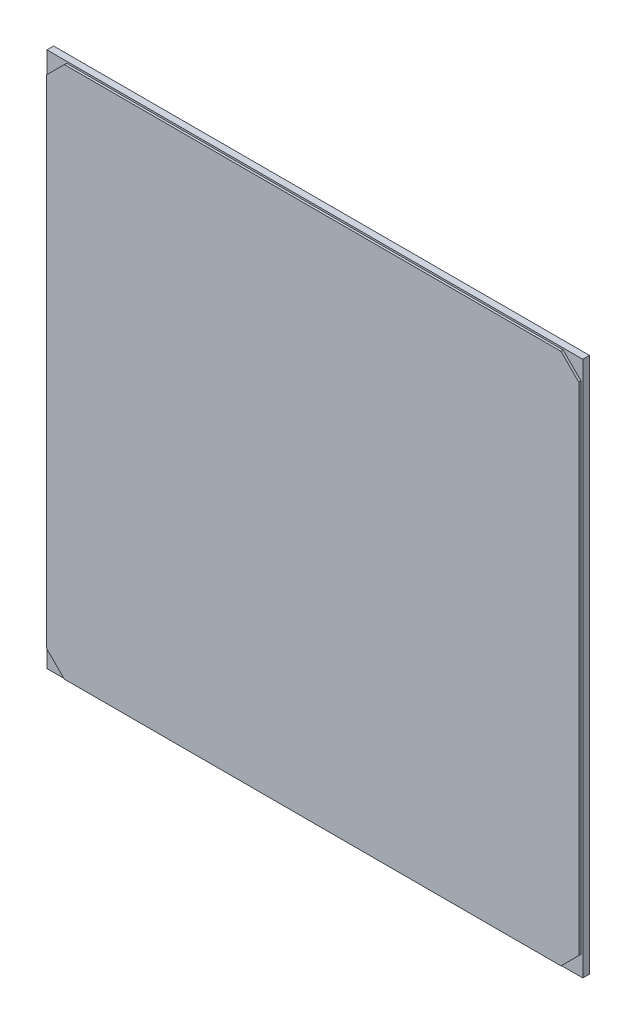
ISO-10303-21;
HEADER;
FILE_DESCRIPTION(('STEP AP214'),'2;1');
FILE_NAME('part.step','',(''),(''),'','','');
FILE_SCHEMA(('AUTOMOTIVE_DESIGN { 1 0 10303 214 1 1 1 1 }'));
ENDSEC;
DATA;
#1=APPLICATION_CONTEXT('core data for automotive mechanical design processes');
#2=APPLICATION_PROTOCOL_DEFINITION('international standard','automotive_design',2000,#1);
#3=PRODUCT_CONTEXT('',#1,'mechanical');
#4=PRODUCT('Part','Part','',(#3));
#5=PRODUCT_RELATED_PRODUCT_CATEGORY('part','',(#4));
#6=PRODUCT_DEFINITION_FORMATION('','',#4);
#7=PRODUCT_DEFINITION_CONTEXT('part definition',#1,'design');
#8=PRODUCT_DEFINITION('design','',#6,#7);
#9=PRODUCT_DEFINITION_SHAPE('','',#8);
#10=(LENGTH_UNIT() NAMED_UNIT(*) SI_UNIT(.MILLI.,.METRE.));
#11=(NAMED_UNIT(*) PLANE_ANGLE_UNIT() SI_UNIT($,.RADIAN.));
#12=(NAMED_UNIT(*) SI_UNIT($,.STERADIAN.) SOLID_ANGLE_UNIT());
#13=UNCERTAINTY_MEASURE_WITH_UNIT(LENGTH_MEASURE(1.E-05),#10,'distance_accuracy_value','');
#14=(GEOMETRIC_REPRESENTATION_CONTEXT(3) GLOBAL_UNCERTAINTY_ASSIGNED_CONTEXT((#13)) GLOBAL_UNIT_ASSIGNED_CONTEXT((#10,
#11,#12)) REPRESENTATION_CONTEXT('',''));
#15=CARTESIAN_POINT('',(0.,0.,0.));
#16=DIRECTION('',(0.,0.,1.));
#17=DIRECTION('',(1.,0.,0.));
#18=AXIS2_PLACEMENT_3D('',#15,#16,#17);
#19=CARTESIAN_POINT('',(0.,0.,3.75));
#20=DIRECTION('',(0.,0.,1.));
#21=DIRECTION('',(1.,0.,0.));
#22=AXIS2_PLACEMENT_3D('',#19,#20,#21);
#23=PLANE('',#22);
#24=DIRECTION('',(0.,-1.,0.));
#25=VECTOR('',#24,1.);
#26=CARTESIAN_POINT('',(-150.00000000001,150.00000000001,3.75000000001));
#27=LINE('',#26,#25);
#28=CARTESIAN_POINT('',(-150.,150.,3.75));
#29=VERTEX_POINT('',#28);
#30=CARTESIAN_POINT('',(-150.,-150.,3.75));
#31=VERTEX_POINT('',#30);
#32=EDGE_CURVE('E11',#29,#31,#27,.T.);
#33=ORIENTED_EDGE('',*,*,#32,.T.);
#34=DIRECTION('',(1.,0.,0.));
#35=VECTOR('',#34,1.);
#36=CARTESIAN_POINT('',(-150.00000000001,-150.00000000001,3.75000000001));
#37=LINE('',#36,#35);
#38=CARTESIAN_POINT('',(150.,-150.,3.75));
#39=VERTEX_POINT('',#38);
#40=EDGE_CURVE('E28',#31,#39,#37,.T.);
#41=ORIENTED_EDGE('',*,*,#40,.T.);
#42=DIRECTION('',(0.,1.,0.));
#43=VECTOR('',#42,1.);
#44=CARTESIAN_POINT('',(150.00000000001,150.00000000001,3.75000000001));
#45=LINE('',#44,#43);
#46=CARTESIAN_POINT('',(150.,150.,3.75));
#47=VERTEX_POINT('',#46);
#48=EDGE_CURVE('E21',#39,#47,#45,.T.);
#49=ORIENTED_EDGE('',*,*,#48,.T.);
#50=DIRECTION('',(-1.,0.,0.));
#51=VECTOR('',#50,1.);
#52=CARTESIAN_POINT('',(-150.00000000001,150.00000000001,3.75000000001));
#53=LINE('',#52,#51);
#54=EDGE_CURVE('E156',#47,#29,#53,.T.);
#55=ORIENTED_EDGE('',*,*,#54,.T.);
#56=EDGE_LOOP('',(#33,#41,#49,#55));
#57=FACE_BOUND('',#56,.T.);
#58=DIRECTION('',(0.707106781186548,-0.707106781186548,0.));
#59=VECTOR('',#58,1.);
#60=CARTESIAN_POINT('',(-149.00000000001,-139.00000000001,3.75000000001));
#61=LINE('',#60,#59);
#62=CARTESIAN_POINT('',(-149.,-139.,3.75));
#63=VERTEX_POINT('',#62);
#64=CARTESIAN_POINT('',(-139.,-149.,3.75));
#65=VERTEX_POINT('',#64);
#66=EDGE_CURVE('E695',#63,#65,#61,.T.);
#67=ORIENTED_EDGE('',*,*,#66,.F.);
#68=DIRECTION('',(0.,-1.,0.));
#69=VECTOR('',#68,1.);
#70=CARTESIAN_POINT('',(-149.00000000001,139.00000000001,3.75000000001));
#71=LINE('',#70,#69);
#72=CARTESIAN_POINT('',(-149.,139.,3.75));
#73=VERTEX_POINT('',#72);
#74=EDGE_CURVE('E694',#73,#63,#71,.T.);
#75=ORIENTED_EDGE('',*,*,#74,.F.);
#76=DIRECTION('',(-0.707106781186548,-0.707106781186548,0.));
#77=VECTOR('',#76,1.);
#78=CARTESIAN_POINT('',(-139.00000000001,149.00000000001,3.75000000001));
#79=LINE('',#78,#77);
#80=CARTESIAN_POINT('',(-139.,149.,3.75));
#81=VERTEX_POINT('',#80);
#82=EDGE_CURVE('E195',#81,#73,#79,.T.);
#83=ORIENTED_EDGE('',*,*,#82,.F.);
#84=DIRECTION('',(-1.,0.,0.));
#85=VECTOR('',#84,1.);
#86=CARTESIAN_POINT('',(139.00000000001,149.00000000001,3.75000000001));
#87=LINE('',#86,#85);
#88=CARTESIAN_POINT('',(139.,149.,3.75));
#89=VERTEX_POINT('',#88);
#90=EDGE_CURVE('E194',#89,#81,#87,.T.);
#91=ORIENTED_EDGE('',*,*,#90,.F.);
#92=DIRECTION('',(-0.707106781186548,0.707106781186548,0.));
#93=VECTOR('',#92,1.);
#94=CARTESIAN_POINT('',(149.00000000001,139.00000000001,3.75000000001));
#95=LINE('',#94,#93);
#96=CARTESIAN_POINT('',(149.,139.,3.75));
#97=VERTEX_POINT('',#96);
#98=EDGE_CURVE('E208',#97,#89,#95,.T.);
#99=ORIENTED_EDGE('',*,*,#98,.F.);
#100=DIRECTION('',(0.,1.,0.));
#101=VECTOR('',#100,1.);
#102=CARTESIAN_POINT('',(149.00000000001,-139.00000000001,3.75000000001));
#103=LINE('',#102,#101);
#104=CARTESIAN_POINT('',(149.,-139.,3.75));
#105=VERTEX_POINT('',#104);
#106=EDGE_CURVE('E759',#105,#97,#103,.T.);
#107=ORIENTED_EDGE('',*,*,#106,.F.);
#108=DIRECTION('',(0.707106781186548,0.707106781186548,0.));
#109=VECTOR('',#108,1.);
#110=CARTESIAN_POINT('',(139.00000000001,-149.00000000001,3.75000000001));
#111=LINE('',#110,#109);
#112=CARTESIAN_POINT('',(139.,-149.,3.75));
#113=VERTEX_POINT('',#112);
#114=EDGE_CURVE('E69',#113,#105,#111,.T.);
#115=ORIENTED_EDGE('',*,*,#114,.F.);
#116=DIRECTION('',(1.,0.,0.));
#117=VECTOR('',#116,1.);
#118=CARTESIAN_POINT('',(-139.00000000001,-149.00000000001,3.75000000001));
#119=LINE('',#118,#117);
#120=EDGE_CURVE('E79',#65,#113,#119,.T.);
#121=ORIENTED_EDGE('',*,*,#120,.F.);
#122=EDGE_LOOP('',(#67,#75,#83,#91,#99,#107,#115,#121));
#123=FACE_BOUND('',#122,.T.);
#124=ADVANCED_FACE('F17',(#57,#123),#23,.T.);
#125=CARTESIAN_POINT('',(-150.,150.,3.75));
#126=DIRECTION('',(1.,0.,0.));
#127=DIRECTION('',(0.,1.,0.));
#128=AXIS2_PLACEMENT_3D('',#125,#126,#127);
#129=PLANE('',#128);
#130=DIRECTION('',(0.,-1.,0.));
#131=VECTOR('',#130,1.);
#132=CARTESIAN_POINT('',(-150.00000000001,150.00000000001,0.));
#133=LINE('',#132,#131);
#134=CARTESIAN_POINT('',(-150.,150.,0.));
#135=VERTEX_POINT('',#134);
#136=CARTESIAN_POINT('',(-150.,-150.,0.));
#137=VERTEX_POINT('',#136);
#138=EDGE_CURVE('E163',#135,#137,#133,.T.);
#139=ORIENTED_EDGE('',*,*,#138,.T.);
#140=DIRECTION('',(0.,0.,-1.));
#141=VECTOR('',#140,1.);
#142=CARTESIAN_POINT('',(-150.00000000001,-150.00000000001,3.75000000001));
#143=LINE('',#142,#141);
#144=EDGE_CURVE('E169',#31,#137,#143,.T.);
#145=ORIENTED_EDGE('',*,*,#144,.F.);
#146=ORIENTED_EDGE('',*,*,#32,.F.);
#147=DIRECTION('',(0.,0.,-1.));
#148=VECTOR('',#147,1.);
#149=CARTESIAN_POINT('',(-150.00000000001,150.00000000001,3.75000000001));
#150=LINE('',#149,#148);
#151=EDGE_CURVE('E167',#29,#135,#150,.T.);
#152=ORIENTED_EDGE('',*,*,#151,.T.);
#153=EDGE_LOOP('',(#139,#145,#146,#152));
#154=FACE_BOUND('',#153,.T.);
#155=ADVANCED_FACE('F19',(#154),#129,.F.);
#156=CARTESIAN_POINT('',(-150.,-150.,3.75));
#157=DIRECTION('',(0.,1.,0.));
#158=DIRECTION('',(1.,0.,0.));
#159=AXIS2_PLACEMENT_3D('',#156,#157,#158);
#160=PLANE('',#159);
#161=DIRECTION('',(1.,0.,0.));
#162=VECTOR('',#161,1.);
#163=CARTESIAN_POINT('',(-150.00000000001,-150.00000000001,0.));
#164=LINE('',#163,#162);
#165=CARTESIAN_POINT('',(150.,-150.,0.));
#166=VERTEX_POINT('',#165);
#167=EDGE_CURVE('E175',#137,#166,#164,.T.);
#168=ORIENTED_EDGE('',*,*,#167,.T.);
#169=DIRECTION('',(0.,0.,-1.));
#170=VECTOR('',#169,1.);
#171=CARTESIAN_POINT('',(150.00000000001,-150.00000000001,3.75000000001));
#172=LINE('',#171,#170);
#173=EDGE_CURVE('E817',#39,#166,#172,.T.);
#174=ORIENTED_EDGE('',*,*,#173,.F.);
#175=ORIENTED_EDGE('',*,*,#40,.F.);
#176=ORIENTED_EDGE('',*,*,#144,.T.);
#177=EDGE_LOOP('',(#168,#174,#175,#176));
#178=FACE_BOUND('',#177,.T.);
#179=ADVANCED_FACE('F360',(#178),#160,.F.);
#180=CARTESIAN_POINT('',(150.,150.,3.75));
#181=DIRECTION('',(-1.,0.,0.));
#182=DIRECTION('',(0.,1.,0.));
#183=AXIS2_PLACEMENT_3D('',#180,#181,#182);
#184=PLANE('',#183);
#185=DIRECTION('',(0.,1.,0.));
#186=VECTOR('',#185,1.);
#187=CARTESIAN_POINT('',(150.00000000001,150.00000000001,0.));
#188=LINE('',#187,#186);
#189=CARTESIAN_POINT('',(150.,150.,0.));
#190=VERTEX_POINT('',#189);
#191=EDGE_CURVE('E818',#166,#190,#188,.T.);
#192=ORIENTED_EDGE('',*,*,#191,.T.);
#193=DIRECTION('',(0.,0.,-1.));
#194=VECTOR('',#193,1.);
#195=CARTESIAN_POINT('',(150.00000000001,150.00000000001,3.75000000001));
#196=LINE('',#195,#194);
#197=EDGE_CURVE('E811',#47,#190,#196,.T.);
#198=ORIENTED_EDGE('',*,*,#197,.F.);
#199=ORIENTED_EDGE('',*,*,#48,.F.);
#200=ORIENTED_EDGE('',*,*,#173,.T.);
#201=EDGE_LOOP('',(#192,#198,#199,#200));
#202=FACE_BOUND('',#201,.T.);
#203=ADVANCED_FACE('F353',(#202),#184,.F.);
#204=CARTESIAN_POINT('',(-150.,150.,3.75));
#205=DIRECTION('',(0.,-1.,0.));
#206=DIRECTION('',(0.,0.,-1.));
#207=AXIS2_PLACEMENT_3D('',#204,#205,#206);
#208=PLANE('',#207);
#209=DIRECTION('',(-1.,0.,0.));
#210=VECTOR('',#209,1.);
#211=CARTESIAN_POINT('',(-150.00000000001,150.00000000001,0.));
#212=LINE('',#211,#210);
#213=EDGE_CURVE('E173',#190,#135,#212,.T.);
#214=ORIENTED_EDGE('',*,*,#213,.T.);
#215=ORIENTED_EDGE('',*,*,#151,.F.);
#216=ORIENTED_EDGE('',*,*,#54,.F.);
#217=ORIENTED_EDGE('',*,*,#197,.T.);
#218=EDGE_LOOP('',(#214,#215,#216,#217));
#219=FACE_BOUND('',#218,.T.);
#220=ADVANCED_FACE('F171',(#219),#208,.F.);
#221=CARTESIAN_POINT('',(0.,0.,0.));
#222=DIRECTION('',(0.,0.,1.));
#223=DIRECTION('',(1.,0.,0.));
#224=AXIS2_PLACEMENT_3D('',#221,#222,#223);
#225=PLANE('',#224);
#226=ORIENTED_EDGE('',*,*,#138,.F.);
#227=ORIENTED_EDGE('',*,*,#213,.F.);
#228=ORIENTED_EDGE('',*,*,#191,.F.);
#229=ORIENTED_EDGE('',*,*,#167,.F.);
#230=EDGE_LOOP('',(#226,#227,#228,#229));
#231=FACE_BOUND('',#230,.T.);
#232=ADVANCED_FACE('F339',(#231),#225,.F.);
#233=CARTESIAN_POINT('',(-149.,139.,5.));
#234=DIRECTION('',(1.,0.,0.));
#235=DIRECTION('',(0.,1.,0.));
#236=AXIS2_PLACEMENT_3D('',#233,#234,#235);
#237=PLANE('',#236);
#238=ORIENTED_EDGE('',*,*,#74,.T.);
#239=DIRECTION('',(0.,0.,-1.));
#240=VECTOR('',#239,1.);
#241=CARTESIAN_POINT('',(-149.00000000001,-139.00000000001,5.00000000001));
#242=LINE('',#241,#240);
#243=CARTESIAN_POINT('',(-149.,-139.,5.));
#244=VERTEX_POINT('',#243);
#245=EDGE_CURVE('E711',#244,#63,#242,.T.);
#246=ORIENTED_EDGE('',*,*,#245,.F.);
#247=DIRECTION('',(0.,-1.,0.));
#248=VECTOR('',#247,1.);
#249=CARTESIAN_POINT('',(-149.00000000001,139.00000000001,5.00000000001));
#250=LINE('',#249,#248);
#251=CARTESIAN_POINT('',(-149.,139.,5.));
#252=VERTEX_POINT('',#251);
#253=EDGE_CURVE('E224',#252,#244,#250,.T.);
#254=ORIENTED_EDGE('',*,*,#253,.F.);
#255=DIRECTION('',(0.,0.,-1.));
#256=VECTOR('',#255,1.);
#257=CARTESIAN_POINT('',(-149.00000000001,139.00000000001,5.00000000001));
#258=LINE('',#257,#256);
#259=EDGE_CURVE('E233',#252,#73,#258,.T.);
#260=ORIENTED_EDGE('',*,*,#259,.T.);
#261=EDGE_LOOP('',(#238,#246,#254,#260));
#262=FACE_BOUND('',#261,.T.);
#263=ADVANCED_FACE('F331',(#262),#237,.F.);
#264=CARTESIAN_POINT('',(-149.,-139.,5.));
#265=DIRECTION('',(0.707106781186548,0.707106781186548,0.));
#266=DIRECTION('',(0.,0.,-1.));
#267=AXIS2_PLACEMENT_3D('',#264,#265,#266);
#268=PLANE('',#267);
#269=ORIENTED_EDGE('',*,*,#66,.T.);
#270=DIRECTION('',(0.,0.,-1.));
#271=VECTOR('',#270,1.);
#272=CARTESIAN_POINT('',(-139.00000000001,-149.00000000001,5.00000000001));
#273=LINE('',#272,#271);
#274=CARTESIAN_POINT('',(-139.,-149.,5.));
#275=VERTEX_POINT('',#274);
#276=EDGE_CURVE('E731',#275,#65,#273,.T.);
#277=ORIENTED_EDGE('',*,*,#276,.F.);
#278=DIRECTION('',(0.707106781186548,-0.707106781186548,0.));
#279=VECTOR('',#278,1.);
#280=CARTESIAN_POINT('',(-149.00000000001,-139.00000000001,5.00000000001));
#281=LINE('',#280,#279);
#282=EDGE_CURVE('E132',#244,#275,#281,.T.);
#283=ORIENTED_EDGE('',*,*,#282,.F.);
#284=ORIENTED_EDGE('',*,*,#245,.T.);
#285=EDGE_LOOP('',(#269,#277,#283,#284));
#286=FACE_BOUND('',#285,.T.);
#287=ADVANCED_FACE('F323',(#286),#268,.F.);
#288=CARTESIAN_POINT('',(-139.,-149.,5.));
#289=DIRECTION('',(0.,1.,0.));
#290=DIRECTION('',(1.,0.,0.));
#291=AXIS2_PLACEMENT_3D('',#288,#289,#290);
#292=PLANE('',#291);
#293=ORIENTED_EDGE('',*,*,#120,.T.);
#294=DIRECTION('',(0.,0.,-1.));
#295=VECTOR('',#294,1.);
#296=CARTESIAN_POINT('',(139.00000000001,-149.00000000001,5.00000000001));
#297=LINE('',#296,#295);
#298=CARTESIAN_POINT('',(139.,-149.,5.));
#299=VERTEX_POINT('',#298);
#300=EDGE_CURVE('E750',#299,#113,#297,.T.);
#301=ORIENTED_EDGE('',*,*,#300,.F.);
#302=DIRECTION('',(1.,0.,0.));
#303=VECTOR('',#302,1.);
#304=CARTESIAN_POINT('',(-139.00000000001,-149.00000000001,5.00000000001));
#305=LINE('',#304,#303);
#306=EDGE_CURVE('E122',#275,#299,#305,.T.);
#307=ORIENTED_EDGE('',*,*,#306,.F.);
#308=ORIENTED_EDGE('',*,*,#276,.T.);
#309=EDGE_LOOP('',(#293,#301,#307,#308));
#310=FACE_BOUND('',#309,.T.);
#311=ADVANCED_FACE('F315',(#310),#292,.F.);
#312=CARTESIAN_POINT('',(139.,-149.,5.));
#313=DIRECTION('',(-0.707106781186548,0.707106781186548,0.));
#314=DIRECTION('',(0.,0.,1.));
#315=AXIS2_PLACEMENT_3D('',#312,#313,#314);
#316=PLANE('',#315);
#317=ORIENTED_EDGE('',*,*,#114,.T.);
#318=DIRECTION('',(0.,0.,-1.));
#319=VECTOR('',#318,1.);
#320=CARTESIAN_POINT('',(149.00000000001,-139.00000000001,5.00000000001));
#321=LINE('',#320,#319);
#322=CARTESIAN_POINT('',(149.,-139.,5.));
#323=VERTEX_POINT('',#322);
#324=EDGE_CURVE('E212',#323,#105,#321,.T.);
#325=ORIENTED_EDGE('',*,*,#324,.F.);
#326=DIRECTION('',(0.707106781186548,0.707106781186548,0.));
#327=VECTOR('',#326,1.);
#328=CARTESIAN_POINT('',(139.00000000001,-149.00000000001,5.00000000001));
#329=LINE('',#328,#327);
#330=EDGE_CURVE('E207',#299,#323,#329,.T.);
#331=ORIENTED_EDGE('',*,*,#330,.F.);
#332=ORIENTED_EDGE('',*,*,#300,.T.);
#333=EDGE_LOOP('',(#317,#325,#331,#332));
#334=FACE_BOUND('',#333,.T.);
#335=ADVANCED_FACE('F307',(#334),#316,.F.);
#336=CARTESIAN_POINT('',(149.,-139.,5.));
#337=DIRECTION('',(-1.,0.,0.));
#338=DIRECTION('',(0.,1.,0.));
#339=AXIS2_PLACEMENT_3D('',#336,#337,#338);
#340=PLANE('',#339);
#341=ORIENTED_EDGE('',*,*,#106,.T.);
#342=DIRECTION('',(0.,0.,-1.));
#343=VECTOR('',#342,1.);
#344=CARTESIAN_POINT('',(149.00000000001,139.00000000001,5.00000000001));
#345=LINE('',#344,#343);
#346=CARTESIAN_POINT('',(149.,139.,5.));
#347=VERTEX_POINT('',#346);
#348=EDGE_CURVE('E204',#347,#97,#345,.T.);
#349=ORIENTED_EDGE('',*,*,#348,.F.);
#350=DIRECTION('',(0.,1.,0.));
#351=VECTOR('',#350,1.);
#352=CARTESIAN_POINT('',(149.00000000001,-139.00000000001,5.00000000001));
#353=LINE('',#352,#351);
#354=EDGE_CURVE('E199',#323,#347,#353,.T.);
#355=ORIENTED_EDGE('',*,*,#354,.F.);
#356=ORIENTED_EDGE('',*,*,#324,.T.);
#357=EDGE_LOOP('',(#341,#349,#355,#356));
#358=FACE_BOUND('',#357,.T.);
#359=ADVANCED_FACE('F300',(#358),#340,.F.);
#360=CARTESIAN_POINT('',(149.,139.,5.));
#361=DIRECTION('',(-0.707106781186548,-0.707106781186548,0.));
#362=DIRECTION('',(-0.707106781186548,0.707106781186548,0.));
#363=AXIS2_PLACEMENT_3D('',#360,#361,#362);
#364=PLANE('',#363);
#365=ORIENTED_EDGE('',*,*,#98,.T.);
#366=DIRECTION('',(0.,0.,-1.));
#367=VECTOR('',#366,1.);
#368=CARTESIAN_POINT('',(139.00000000001,149.00000000001,5.00000000001));
#369=LINE('',#368,#367);
#370=CARTESIAN_POINT('',(139.,149.,5.));
#371=VERTEX_POINT('',#370);
#372=EDGE_CURVE('E190',#371,#89,#369,.T.);
#373=ORIENTED_EDGE('',*,*,#372,.F.);
#374=DIRECTION('',(-0.707106781186548,0.707106781186548,0.));
#375=VECTOR('',#374,1.);
#376=CARTESIAN_POINT('',(149.00000000001,139.00000000001,5.00000000001));
#377=LINE('',#376,#375);
#378=EDGE_CURVE('E196',#347,#371,#377,.T.);
#379=ORIENTED_EDGE('',*,*,#378,.F.);
#380=ORIENTED_EDGE('',*,*,#348,.T.);
#381=EDGE_LOOP('',(#365,#373,#379,#380));
#382=FACE_BOUND('',#381,.T.);
#383=ADVANCED_FACE('F293',(#382),#364,.F.);
#384=CARTESIAN_POINT('',(139.,149.,5.));
#385=DIRECTION('',(0.,-1.,0.));
#386=DIRECTION('',(0.,0.,-1.));
#387=AXIS2_PLACEMENT_3D('',#384,#385,#386);
#388=PLANE('',#387);
#389=ORIENTED_EDGE('',*,*,#90,.T.);
#390=DIRECTION('',(0.,0.,-1.));
#391=VECTOR('',#390,1.);
#392=CARTESIAN_POINT('',(-139.00000000001,149.00000000001,5.00000000001));
#393=LINE('',#392,#391);
#394=CARTESIAN_POINT('',(-139.,149.,5.));
#395=VERTEX_POINT('',#394);
#396=EDGE_CURVE('E188',#395,#81,#393,.T.);
#397=ORIENTED_EDGE('',*,*,#396,.F.);
#398=DIRECTION('',(-1.,0.,0.));
#399=VECTOR('',#398,1.);
#400=CARTESIAN_POINT('',(139.00000000001,149.00000000001,5.00000000001));
#401=LINE('',#400,#399);
#402=EDGE_CURVE('E200',#371,#395,#401,.T.);
#403=ORIENTED_EDGE('',*,*,#402,.F.);
#404=ORIENTED_EDGE('',*,*,#372,.T.);
#405=EDGE_LOOP('',(#389,#397,#403,#404));
#406=FACE_BOUND('',#405,.T.);
#407=ADVANCED_FACE('F257',(#406),#388,.F.);
#408=CARTESIAN_POINT('',(-139.,149.,5.));
#409=DIRECTION('',(0.707106781186548,-0.707106781186548,0.));
#410=DIRECTION('',(0.,0.,-1.));
#411=AXIS2_PLACEMENT_3D('',#408,#409,#410);
#412=PLANE('',#411);
#413=ORIENTED_EDGE('',*,*,#82,.T.);
#414=ORIENTED_EDGE('',*,*,#259,.F.);
#415=DIRECTION('',(-0.707106781186548,-0.707106781186548,0.));
#416=VECTOR('',#415,1.);
#417=CARTESIAN_POINT('',(-139.00000000001,149.00000000001,5.00000000001));
#418=LINE('',#417,#416);
#419=EDGE_CURVE('E215',#395,#252,#418,.T.);
#420=ORIENTED_EDGE('',*,*,#419,.F.);
#421=ORIENTED_EDGE('',*,*,#396,.T.);
#422=EDGE_LOOP('',(#413,#414,#420,#421));
#423=FACE_BOUND('',#422,.T.);
#424=ADVANCED_FACE('F231',(#423),#412,.F.);
#425=CARTESIAN_POINT('',(0.,0.,5.));
#426=DIRECTION('',(0.,0.,1.));
#427=DIRECTION('',(1.,0.,0.));
#428=AXIS2_PLACEMENT_3D('',#425,#426,#427);
#429=PLANE('',#428);
#430=ORIENTED_EDGE('',*,*,#253,.T.);
#431=ORIENTED_EDGE('',*,*,#282,.T.);
#432=ORIENTED_EDGE('',*,*,#306,.T.);
#433=ORIENTED_EDGE('',*,*,#330,.T.);
#434=ORIENTED_EDGE('',*,*,#354,.T.);
#435=ORIENTED_EDGE('',*,*,#378,.T.);
#436=ORIENTED_EDGE('',*,*,#402,.T.);
#437=ORIENTED_EDGE('',*,*,#419,.T.);
#438=EDGE_LOOP('',(#430,#431,#432,#433,#434,#435,#436,#437));
#439=FACE_BOUND('',#438,.T.);
#440=ADVANCED_FACE('F223',(#439),#429,.T.);
#441=CLOSED_SHELL('',(#124,#155,#179,#203,#220,#232,#263,#287,#311,#335,#359,#383,#407,#424,#440));
#442=MANIFOLD_SOLID_BREP('B1',#441);
#443=ADVANCED_BREP_SHAPE_REPRESENTATION('',(#18,#442),#14);
#444=SHAPE_DEFINITION_REPRESENTATION(#9,#443);
ENDSEC;
END-ISO-10303-21;
